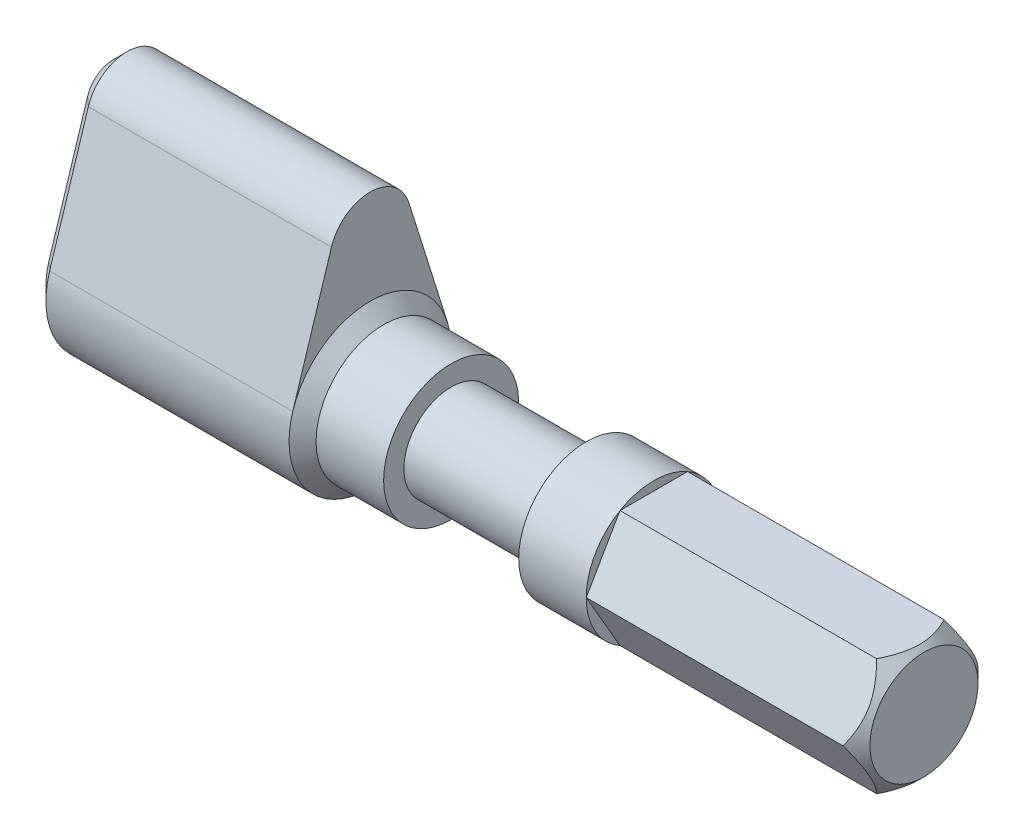
ISO-10303-21;
HEADER;
FILE_DESCRIPTION(('STEP AP214'),'2;1');
FILE_NAME('part.step','',(''),(''),'','','');
FILE_SCHEMA(('AUTOMOTIVE_DESIGN { 1 0 10303 214 1 1 1 1 }'));
ENDSEC;
DATA;
#1=APPLICATION_CONTEXT('core data for automotive mechanical design processes');
#2=APPLICATION_PROTOCOL_DEFINITION('international standard','automotive_design',2000,#1);
#3=PRODUCT_CONTEXT('',#1,'mechanical');
#4=PRODUCT('Part','Part','',(#3));
#5=PRODUCT_RELATED_PRODUCT_CATEGORY('part','',(#4));
#6=PRODUCT_DEFINITION_FORMATION('','',#4);
#7=PRODUCT_DEFINITION_CONTEXT('part definition',#1,'design');
#8=PRODUCT_DEFINITION('design','',#6,#7);
#9=PRODUCT_DEFINITION_SHAPE('','',#8);
#10=(LENGTH_UNIT() NAMED_UNIT(*) SI_UNIT(.MILLI.,.METRE.));
#11=(NAMED_UNIT(*) PLANE_ANGLE_UNIT() SI_UNIT($,.RADIAN.));
#12=(NAMED_UNIT(*) SI_UNIT($,.STERADIAN.) SOLID_ANGLE_UNIT());
#13=UNCERTAINTY_MEASURE_WITH_UNIT(LENGTH_MEASURE(1.E-05),#10,'distance_accuracy_value','');
#14=(GEOMETRIC_REPRESENTATION_CONTEXT(3) GLOBAL_UNCERTAINTY_ASSIGNED_CONTEXT((#13)) GLOBAL_UNIT_ASSIGNED_CONTEXT((#10,
#11,#12)) REPRESENTATION_CONTEXT('',''));
#15=CARTESIAN_POINT('',(0.,0.,0.));
#16=DIRECTION('',(0.,0.,1.));
#17=DIRECTION('',(1.,0.,0.));
#18=AXIS2_PLACEMENT_3D('',#15,#16,#17);
#19=CARTESIAN_POINT('',(0.,0.,0.));
#20=DIRECTION('',(-1.,0.,0.));
#21=DIRECTION('',(0.,0.,1.));
#22=AXIS2_PLACEMENT_3D('',#19,#20,#21);
#23=CYLINDRICAL_SURFACE('',#22,5.);
#24=CARTESIAN_POINT('',(25.,0.,0.));
#25=DIRECTION('',(-1.,0.,0.));
#26=DIRECTION('',(0.,-1.,0.));
#27=AXIS2_PLACEMENT_3D('',#24,#25,#26);
#28=CIRCLE('',#27,5.);
#29=CARTESIAN_POINT('',(25.,-5.,0.));
#30=VERTEX_POINT('',#29);
#31=EDGE_CURVE('E43',#30,#30,#28,.T.);
#32=ORIENTED_EDGE('',*,*,#31,.T.);
#33=EDGE_LOOP('',(#32));
#34=FACE_BOUND('',#33,.T.);
#35=CARTESIAN_POINT('',(20.,0.,0.));
#36=DIRECTION('',(-1.,0.,0.));
#37=DIRECTION('',(0.,0.,1.));
#38=AXIS2_PLACEMENT_3D('',#35,#36,#37);
#39=CIRCLE('',#38,5.);
#40=CARTESIAN_POINT('',(20.,0.,5.));
#41=VERTEX_POINT('',#40);
#42=EDGE_CURVE('E227',#41,#41,#39,.T.);
#43=ORIENTED_EDGE('',*,*,#42,.F.);
#44=EDGE_LOOP('',(#43));
#45=FACE_BOUND('',#44,.T.);
#46=ADVANCED_FACE('F38',(#34,#45),#23,.T.);
#47=CARTESIAN_POINT('',(0.,0.,0.));
#48=DIRECTION('',(1.,0.,0.));
#49=DIRECTION('',(0.,0.,-1.));
#50=AXIS2_PLACEMENT_3D('',#47,#48,#49);
#51=PLANE('',#50);
#52=DIRECTION('',(0.,0.953939201416946,-0.3));
#53=VECTOR('',#52,1.);
#54=CARTESIAN_POINT('',(0.,1.5,4.76969600708472));
#55=LINE('',#54,#53);
#56=CARTESIAN_POINT('',(0.,1.5,4.76969600708472));
#57=VERTEX_POINT('',#56);
#58=CARTESIAN_POINT('',(0.,10.6,1.90787840283388));
#59=VERTEX_POINT('',#58);
#60=EDGE_CURVE('E247',#57,#59,#55,.T.);
#61=ORIENTED_EDGE('',*,*,#60,.T.);
#62=CARTESIAN_POINT('',(0.,10.,0.));
#63=DIRECTION('',(1.,0.,0.));
#64=DIRECTION('',(0.,0.,-1.));
#65=AXIS2_PLACEMENT_3D('',#62,#63,#64);
#66=CIRCLE('',#65,1.99999999999999);
#67=CARTESIAN_POINT('',(0.,10.6,-1.90787840283388));
#68=VERTEX_POINT('',#67);
#69=EDGE_CURVE('E251',#59,#68,#66,.F.);
#70=ORIENTED_EDGE('',*,*,#69,.T.);
#71=DIRECTION('',(0.,-0.953939201416946,-0.3));
#72=VECTOR('',#71,1.);
#73=CARTESIAN_POINT('',(0.,1.5,-4.76969600708472));
#74=LINE('',#73,#72);
#75=CARTESIAN_POINT('',(0.,1.5,-4.76969600708472));
#76=VERTEX_POINT('',#75);
#77=EDGE_CURVE('E249',#68,#76,#74,.T.);
#78=ORIENTED_EDGE('',*,*,#77,.T.);
#79=CARTESIAN_POINT('',(0.,0.,0.));
#80=DIRECTION('',(1.,0.,0.));
#81=DIRECTION('',(0.,0.,-1.));
#82=AXIS2_PLACEMENT_3D('',#79,#80,#81);
#83=CIRCLE('',#82,4.99999999999999);
#84=EDGE_CURVE('E245',#76,#57,#83,.F.);
#85=ORIENTED_EDGE('',*,*,#84,.T.);
#86=EDGE_LOOP('',(#61,#70,#78,#85));
#87=FACE_BOUND('',#86,.T.);
#88=ADVANCED_FACE('F328',(#87),#51,.F.);
#89=CARTESIAN_POINT('',(0.,0.,0.));
#90=DIRECTION('',(-1.,0.,0.));
#91=DIRECTION('',(0.,0.,1.));
#92=AXIS2_PLACEMENT_3D('',#89,#90,#91);
#93=CYLINDRICAL_SURFACE('',#92,6.);
#94=DIRECTION('',(-1.,0.,0.));
#95=VECTOR('',#94,1.);
#96=CARTESIAN_POINT('',(19.,1.8,5.72363520850167));
#97=LINE('',#96,#95);
#98=CARTESIAN_POINT('',(19.,1.8,5.72363520850167));
#99=VERTEX_POINT('',#98);
#100=CARTESIAN_POINT('',(1.00000000000001,1.8,5.72363520850167));
#101=VERTEX_POINT('',#100);
#102=EDGE_CURVE('E224',#99,#101,#97,.T.);
#103=ORIENTED_EDGE('',*,*,#102,.T.);
#104=CARTESIAN_POINT('',(1.00000000000001,0.,0.));
#105=DIRECTION('',(1.,0.,0.));
#106=DIRECTION('',(0.,0.,-1.));
#107=AXIS2_PLACEMENT_3D('',#104,#105,#106);
#108=CIRCLE('',#107,6.);
#109=CARTESIAN_POINT('',(1.00000000000001,1.8,-5.72363520850168));
#110=VERTEX_POINT('',#109);
#111=EDGE_CURVE('E261',#101,#110,#108,.T.);
#112=ORIENTED_EDGE('',*,*,#111,.T.);
#113=DIRECTION('',(-1.,0.,0.));
#114=VECTOR('',#113,1.);
#115=CARTESIAN_POINT('',(19.,1.8,-5.72363520850168));
#116=LINE('',#115,#114);
#117=CARTESIAN_POINT('',(19.,1.8,-5.72363520850168));
#118=VERTEX_POINT('',#117);
#119=EDGE_CURVE('E228',#118,#110,#116,.T.);
#120=ORIENTED_EDGE('',*,*,#119,.F.);
#121=CARTESIAN_POINT('',(19.,0.,0.));
#122=DIRECTION('',(-1.,0.,0.));
#123=DIRECTION('',(0.,0.,1.));
#124=AXIS2_PLACEMENT_3D('',#121,#122,#123);
#125=CIRCLE('',#124,6.);
#126=EDGE_CURVE('E238',#118,#99,#125,.T.);
#127=ORIENTED_EDGE('',*,*,#126,.T.);
#128=EDGE_LOOP('',(#103,#112,#120,#127));
#129=FACE_BOUND('',#128,.T.);
#130=ADVANCED_FACE('F325',(#129),#93,.T.);
#131=CARTESIAN_POINT('',(19.,0.,0.));
#132=DIRECTION('',(-1.,0.,0.));
#133=DIRECTION('',(0.,0.,1.));
#134=AXIS2_PLACEMENT_3D('',#131,#132,#133);
#135=CONICAL_SURFACE('',#134,6.,0.785398163397451);
#136=ORIENTED_EDGE('',*,*,#42,.T.);
#137=EDGE_LOOP('',(#136));
#138=FACE_BOUND('',#137,.T.);
#139=EDGE_CURVE('E239',#99,#118,#125,.T.);
#140=ORIENTED_EDGE('',*,*,#139,.F.);
#141=ORIENTED_EDGE('',*,*,#126,.F.);
#142=EDGE_LOOP('',(#140,#141));
#143=FACE_BOUND('',#142,.T.);
#144=ADVANCED_FACE('F316',(#138,#143),#135,.T.);
#145=CARTESIAN_POINT('',(19.,1.8,5.72363520850167));
#146=DIRECTION('',(0.,-0.3,-0.953939201416946));
#147=DIRECTION('',(0.,0.953939201416946,-0.3));
#148=AXIS2_PLACEMENT_3D('',#145,#146,#147);
#149=PLANE('',#148);
#150=DIRECTION('',(-1.,0.,0.));
#151=VECTOR('',#150,1.);
#152=CARTESIAN_POINT('',(19.,10.9,2.86181760425084));
#153=LINE('',#152,#151);
#154=CARTESIAN_POINT('',(19.,10.9,2.86181760425084));
#155=VERTEX_POINT('',#154);
#156=CARTESIAN_POINT('',(1.00000000000001,10.9,2.86181760425084));
#157=VERTEX_POINT('',#156);
#158=EDGE_CURVE('E223',#155,#157,#153,.T.);
#159=ORIENTED_EDGE('',*,*,#158,.T.);
#160=DIRECTION('',(0.,-0.953939201416946,0.3));
#161=VECTOR('',#160,1.);
#162=CARTESIAN_POINT('',(1.00000000000001,1.8,5.72363520850167));
#163=LINE('',#162,#161);
#164=EDGE_CURVE('E259',#157,#101,#163,.T.);
#165=ORIENTED_EDGE('',*,*,#164,.T.);
#166=ORIENTED_EDGE('',*,*,#102,.F.);
#167=DIRECTION('',(0.,-0.953939201416946,0.3));
#168=VECTOR('',#167,1.);
#169=CARTESIAN_POINT('',(19.,1.8,5.72363520850167));
#170=LINE('',#169,#168);
#171=EDGE_CURVE('E213',#155,#99,#170,.T.);
#172=ORIENTED_EDGE('',*,*,#171,.F.);
#173=EDGE_LOOP('',(#159,#165,#166,#172));
#174=FACE_BOUND('',#173,.T.);
#175=ADVANCED_FACE('F309',(#174),#149,.F.);
#176=CARTESIAN_POINT('',(19.,1.8,-5.72363520850168));
#177=DIRECTION('',(0.,0.3,-0.953939201416946));
#178=DIRECTION('',(0.,0.953939201416946,0.3));
#179=AXIS2_PLACEMENT_3D('',#176,#177,#178);
#180=PLANE('',#179);
#181=ORIENTED_EDGE('',*,*,#119,.T.);
#182=DIRECTION('',(0.,0.953939201416946,0.3));
#183=VECTOR('',#182,1.);
#184=CARTESIAN_POINT('',(1.00000000000001,10.9,-2.86181760425084));
#185=LINE('',#184,#183);
#186=CARTESIAN_POINT('',(1.00000000000001,10.9,-2.86181760425084));
#187=VERTEX_POINT('',#186);
#188=EDGE_CURVE('E257',#110,#187,#185,.T.);
#189=ORIENTED_EDGE('',*,*,#188,.T.);
#190=DIRECTION('',(-1.,0.,0.));
#191=VECTOR('',#190,1.);
#192=CARTESIAN_POINT('',(19.,10.9,-2.86181760425084));
#193=LINE('',#192,#191);
#194=CARTESIAN_POINT('',(19.,10.9,-2.86181760425084));
#195=VERTEX_POINT('',#194);
#196=EDGE_CURVE('E231',#195,#187,#193,.T.);
#197=ORIENTED_EDGE('',*,*,#196,.F.);
#198=DIRECTION('',(0.,-0.953939201416946,-0.3));
#199=VECTOR('',#198,1.);
#200=CARTESIAN_POINT('',(19.,1.8,-5.72363520850168));
#201=LINE('',#200,#199);
#202=EDGE_CURVE('E220',#195,#118,#201,.T.);
#203=ORIENTED_EDGE('',*,*,#202,.T.);
#204=EDGE_LOOP('',(#181,#189,#197,#203));
#205=FACE_BOUND('',#204,.T.);
#206=ADVANCED_FACE('F306',(#205),#180,.T.);
#207=CARTESIAN_POINT('',(19.,10.,0.));
#208=DIRECTION('',(-1.,0.,0.));
#209=DIRECTION('',(0.,0.,1.));
#210=AXIS2_PLACEMENT_3D('',#207,#208,#209);
#211=CYLINDRICAL_SURFACE('',#210,3.);
#212=ORIENTED_EDGE('',*,*,#196,.T.);
#213=CARTESIAN_POINT('',(1.00000000000001,10.,0.));
#214=DIRECTION('',(1.,0.,0.));
#215=DIRECTION('',(0.,0.,-1.));
#216=AXIS2_PLACEMENT_3D('',#213,#214,#215);
#217=CIRCLE('',#216,3.);
#218=EDGE_CURVE('E254',#187,#157,#217,.T.);
#219=ORIENTED_EDGE('',*,*,#218,.T.);
#220=ORIENTED_EDGE('',*,*,#158,.F.);
#221=CARTESIAN_POINT('',(19.,10.,0.));
#222=DIRECTION('',(-1.,0.,0.));
#223=DIRECTION('',(0.,0.,1.));
#224=AXIS2_PLACEMENT_3D('',#221,#222,#223);
#225=CIRCLE('',#224,3.);
#226=EDGE_CURVE('E216',#155,#195,#225,.T.);
#227=ORIENTED_EDGE('',*,*,#226,.T.);
#228=EDGE_LOOP('',(#212,#219,#220,#227));
#229=FACE_BOUND('',#228,.T.);
#230=ADVANCED_FACE('F304',(#229),#211,.T.);
#231=CARTESIAN_POINT('',(19.,0.,0.));
#232=DIRECTION('',(-1.,0.,0.));
#233=DIRECTION('',(0.,0.,1.));
#234=AXIS2_PLACEMENT_3D('',#231,#232,#233);
#235=PLANE('',#234);
#236=ORIENTED_EDGE('',*,*,#171,.T.);
#237=ORIENTED_EDGE('',*,*,#139,.T.);
#238=ORIENTED_EDGE('',*,*,#202,.F.);
#239=ORIENTED_EDGE('',*,*,#226,.F.);
#240=EDGE_LOOP('',(#236,#237,#238,#239));
#241=FACE_BOUND('',#240,.T.);
#242=ADVANCED_FACE('F301',(#241),#235,.F.);
#243=CARTESIAN_POINT('',(0.,0.,0.));
#244=DIRECTION('',(1.,0.,0.));
#245=DIRECTION('',(0.,0.,-1.));
#246=AXIS2_PLACEMENT_3D('',#243,#244,#245);
#247=CONICAL_SURFACE('',#246,4.99999999999999,0.785398163397449);
#248=DIRECTION('',(-0.707106781186547,-0.212132034355965,0.674536878161602));
#249=VECTOR('',#248,1.);
#250=CARTESIAN_POINT('',(1.00000000000001,1.8,-5.72363520850167));
#251=LINE('',#250,#249);
#252=EDGE_CURVE('E266',#110,#76,#251,.T.);
#253=ORIENTED_EDGE('',*,*,#252,.F.);
#254=ORIENTED_EDGE('',*,*,#111,.F.);
#255=DIRECTION('',(0.707106781186547,0.212132034355964,0.674536878161602));
#256=VECTOR('',#255,1.);
#257=CARTESIAN_POINT('',(0.,1.5,4.76969600708472));
#258=LINE('',#257,#256);
#259=EDGE_CURVE('E217',#57,#101,#258,.T.);
#260=ORIENTED_EDGE('',*,*,#259,.F.);
#261=ORIENTED_EDGE('',*,*,#84,.F.);
#262=EDGE_LOOP('',(#253,#254,#260,#261));
#263=FACE_BOUND('',#262,.T.);
#264=ADVANCED_FACE('F41',(#263),#247,.T.);
#265=CARTESIAN_POINT('',(1.00000000000001,1.8,5.72363520850167));
#266=DIRECTION('',(0.707106781186547,-0.212132034355964,-0.674536878161602));
#267=DIRECTION('',(0.,-0.953939201416946,0.3));
#268=AXIS2_PLACEMENT_3D('',#265,#266,#267);
#269=PLANE('',#268);
#270=ORIENTED_EDGE('',*,*,#259,.T.);
#271=ORIENTED_EDGE('',*,*,#164,.F.);
#272=DIRECTION('',(0.707106781186548,0.212132034355964,0.674536878161602));
#273=VECTOR('',#272,1.);
#274=CARTESIAN_POINT('',(0.,10.6,1.90787840283388));
#275=LINE('',#274,#273);
#276=EDGE_CURVE('E264',#59,#157,#275,.T.);
#277=ORIENTED_EDGE('',*,*,#276,.F.);
#278=ORIENTED_EDGE('',*,*,#60,.F.);
#279=EDGE_LOOP('',(#270,#271,#277,#278));
#280=FACE_BOUND('',#279,.T.);
#281=ADVANCED_FACE('F510',(#280),#269,.F.);
#282=CARTESIAN_POINT('',(0.,1.5,-4.76969600708472));
#283=DIRECTION('',(-0.707106781186547,0.212132034355964,-0.674536878161602));
#284=DIRECTION('',(0.,0.953939201416946,0.3));
#285=AXIS2_PLACEMENT_3D('',#282,#283,#284);
#286=PLANE('',#285);
#287=ORIENTED_EDGE('',*,*,#252,.T.);
#288=ORIENTED_EDGE('',*,*,#77,.F.);
#289=DIRECTION('',(-0.707106781186548,-0.212132034355964,0.674536878161602));
#290=VECTOR('',#289,1.);
#291=CARTESIAN_POINT('',(1.00000000000001,10.9,-2.86181760425084));
#292=LINE('',#291,#290);
#293=EDGE_CURVE('E202',#187,#68,#292,.T.);
#294=ORIENTED_EDGE('',*,*,#293,.F.);
#295=ORIENTED_EDGE('',*,*,#188,.F.);
#296=EDGE_LOOP('',(#287,#288,#294,#295));
#297=FACE_BOUND('',#296,.T.);
#298=ADVANCED_FACE('F359',(#297),#286,.T.);
#299=CARTESIAN_POINT('',(0.,10.,0.));
#300=DIRECTION('',(1.,0.,0.));
#301=DIRECTION('',(0.,0.,-1.));
#302=AXIS2_PLACEMENT_3D('',#299,#300,#301);
#303=CONICAL_SURFACE('',#302,1.99999999999999,0.785398163397448);
#304=ORIENTED_EDGE('',*,*,#276,.T.);
#305=ORIENTED_EDGE('',*,*,#218,.F.);
#306=ORIENTED_EDGE('',*,*,#293,.T.);
#307=ORIENTED_EDGE('',*,*,#69,.F.);
#308=EDGE_LOOP('',(#304,#305,#306,#307));
#309=FACE_BOUND('',#308,.T.);
#310=ADVANCED_FACE('F351',(#309),#303,.T.);
#311=CARTESIAN_POINT('',(25.,3.5,0.));
#312=DIRECTION('',(-1.,0.,0.));
#313=DIRECTION('',(0.,-1.,0.));
#314=AXIS2_PLACEMENT_3D('',#311,#312,#313);
#315=PLANE('',#314);
#316=CARTESIAN_POINT('',(25.,0.,0.));
#317=DIRECTION('',(1.,0.,0.));
#318=DIRECTION('',(0.,1.,0.));
#319=AXIS2_PLACEMENT_3D('',#316,#317,#318);
#320=CIRCLE('',#319,3.50000000000001);
#321=CARTESIAN_POINT('',(25.,3.5,0.));
#322=VERTEX_POINT('',#321);
#323=EDGE_CURVE('E185',#322,#322,#320,.T.);
#324=ORIENTED_EDGE('',*,*,#323,.F.);
#325=EDGE_LOOP('',(#324));
#326=FACE_BOUND('',#325,.T.);
#327=ORIENTED_EDGE('',*,*,#31,.F.);
#328=EDGE_LOOP('',(#327));
#329=FACE_BOUND('',#328,.T.);
#330=ADVANCED_FACE('F348',(#326,#329),#315,.F.);
#331=CARTESIAN_POINT('',(35.,3.5,0.));
#332=DIRECTION('',(1.,0.,0.));
#333=DIRECTION('',(0.,1.,0.));
#334=AXIS2_PLACEMENT_3D('',#331,#332,#333);
#335=PLANE('',#334);
#336=CARTESIAN_POINT('',(35.,0.,0.));
#337=DIRECTION('',(1.,0.,0.));
#338=DIRECTION('',(0.,1.,0.));
#339=AXIS2_PLACEMENT_3D('',#336,#337,#338);
#340=CIRCLE('',#339,3.50000000000003);
#341=CARTESIAN_POINT('',(35.,3.5,0.));
#342=VERTEX_POINT('',#341);
#343=EDGE_CURVE('E180',#342,#342,#340,.T.);
#344=ORIENTED_EDGE('',*,*,#343,.T.);
#345=EDGE_LOOP('',(#344));
#346=FACE_BOUND('',#345,.T.);
#347=CARTESIAN_POINT('',(35.,0.,0.));
#348=DIRECTION('',(1.,0.,0.));
#349=DIRECTION('',(0.,1.,0.));
#350=AXIS2_PLACEMENT_3D('',#347,#348,#349);
#351=CIRCLE('',#350,5.);
#352=CARTESIAN_POINT('',(35.,5.,0.));
#353=VERTEX_POINT('',#352);
#354=EDGE_CURVE('E178',#353,#353,#351,.T.);
#355=ORIENTED_EDGE('',*,*,#354,.F.);
#356=EDGE_LOOP('',(#355));
#357=FACE_BOUND('',#356,.T.);
#358=ADVANCED_FACE('F350',(#346,#357),#335,.F.);
#359=CARTESIAN_POINT('',(40.,0.,0.));
#360=DIRECTION('',(1.,0.,0.));
#361=DIRECTION('',(0.,1.,0.));
#362=AXIS2_PLACEMENT_3D('',#359,#360,#361);
#363=CYLINDRICAL_SURFACE('',#362,3.50000000000002);
#364=ORIENTED_EDGE('',*,*,#343,.F.);
#365=EDGE_LOOP('',(#364));
#366=FACE_BOUND('',#365,.T.);
#367=ORIENTED_EDGE('',*,*,#323,.T.);
#368=EDGE_LOOP('',(#367));
#369=FACE_BOUND('',#368,.T.);
#370=ADVANCED_FACE('F321',(#366,#369),#363,.T.);
#371=CARTESIAN_POINT('',(60.,5.,0.));
#372=DIRECTION('',(-1.,0.,0.));
#373=DIRECTION('',(0.,0.,1.));
#374=AXIS2_PLACEMENT_3D('',#371,#372,#373);
#375=PLANE('',#374);
#376=CARTESIAN_POINT('',(60.,0.,0.));
#377=DIRECTION('',(-1.,0.,0.));
#378=DIRECTION('',(0.,0.,1.));
#379=AXIS2_PLACEMENT_3D('',#376,#377,#378);
#380=CIRCLE('',#379,3.99999999999999);
#381=CARTESIAN_POINT('',(60.,0.,3.99999999999999));
#382=VERTEX_POINT('',#381);
#383=EDGE_CURVE('E242',#382,#382,#380,.F.);
#384=ORIENTED_EDGE('',*,*,#383,.T.);
#385=EDGE_LOOP('',(#384));
#386=FACE_BOUND('',#385,.T.);
#387=ADVANCED_FACE('F318',(#386),#375,.F.);
#388=CARTESIAN_POINT('',(59.,0.,0.));
#389=DIRECTION('',(-1.,0.,0.));
#390=DIRECTION('',(0.,0.,1.));
#391=AXIS2_PLACEMENT_3D('',#388,#389,#390);
#392=CONICAL_SURFACE('',#391,5.,0.785398163397454);
#393=ORIENTED_EDGE('',*,*,#383,.F.);
#394=EDGE_LOOP('',(#393));
#395=FACE_BOUND('',#394,.T.);
#396=CARTESIAN_POINT('',(55.253678646667,-4.33012701892227,7.59921951359276));
#397=CARTESIAN_POINT('',(55.351184265633,-4.33012701892227,7.48699247756579));
#398=CARTESIAN_POINT('',(55.4483913750578,-4.33012701892227,7.37450605913894));
#399=CARTESIAN_POINT('',(55.6421247861555,-4.33012701892227,7.14894544849829));
#400=CARTESIAN_POINT('',(55.7386510767765,-4.33012701892227,7.03587124679438));
#401=CARTESIAN_POINT('',(56.0271662461691,-4.33012701892226,6.6955651902009));
#402=CARTESIAN_POINT('',(56.218002079582,-4.33012701892226,6.46735241242819));
#403=CARTESIAN_POINT('',(56.5999051779751,-4.33012701892226,6.002449107588));
#404=CARTESIAN_POINT('',(56.7908811722092,-4.33012701892225,5.76568333547577));
#405=CARTESIAN_POINT('',(57.1671121203224,-4.33012701892225,5.2877302731454));
#406=CARTESIAN_POINT('',(57.3523684910034,-4.33012701892225,5.04654410187618));
#407=CARTESIAN_POINT('',(57.7152539731287,-4.33012701892224,4.55795427576481));
#408=CARTESIAN_POINT('',(57.8928729934364,-4.33012701892224,4.31054304061876));
#409=CARTESIAN_POINT('',(58.1507750381669,-4.33012701892223,3.93341818828443));
#410=CARTESIAN_POINT('',(58.2353592003148,-4.33012701892223,3.80664733518679));
#411=CARTESIAN_POINT('',(58.4009968353064,-4.33012701892223,3.55082533863251));
#412=CARTESIAN_POINT('',(58.4820506125323,-4.33012701892223,3.42177439311452));
#413=CARTESIAN_POINT('',(58.639251894182,-4.33012701892223,3.16199806432151));
#414=CARTESIAN_POINT('',(58.7154310235148,-4.33012701892222,3.03129190461657));
#415=CARTESIAN_POINT('',(58.8625188449221,-4.33012701892222,2.76690858749133));
#416=CARTESIAN_POINT('',(58.9334269012938,-4.33012701892222,2.63323107423648));
#417=CARTESIAN_POINT('',(59.0685737969327,-4.33012701892222,2.36276633080908));
#418=CARTESIAN_POINT('',(59.1328222970525,-4.33012701892222,2.22598396638425));
#419=CARTESIAN_POINT('',(59.2531442688084,-4.33012701892221,1.94889793365945));
#420=CARTESIAN_POINT('',(59.3092209000482,-4.33012701892221,1.80859565104077));
#421=CARTESIAN_POINT('',(59.4124815838396,-4.33012701892221,1.52109101625562));
#422=CARTESIAN_POINT('',(59.4594340085931,-4.33012701892221,1.37380428933824));
#423=CARTESIAN_POINT('',(59.5405572677146,-4.3301270189222,1.07571750853234));
#424=CARTESIAN_POINT('',(59.5747301384307,-4.3301270189222,0.924918018453817));
#425=CARTESIAN_POINT('',(59.6280097359017,-4.3301270189222,0.621622317866048));
#426=CARTESIAN_POINT('',(59.6472114182584,-4.3301270189222,0.469143126258926));
#427=CARTESIAN_POINT('',(59.6694938314688,-4.3301270189222,0.163002209399381));
#428=CARTESIAN_POINT('',(59.6725764251674,-4.33012701892219,0.00934062284916741));
#429=CARTESIAN_POINT('',(59.6623702719492,-4.33012701892219,-0.297696033322854));
#430=CARTESIAN_POINT('',(59.6490527373931,-4.33012701892219,-0.451070124483411));
#431=CARTESIAN_POINT('',(59.6070212422452,-4.33012701892219,-0.755678508307949));
#432=CARTESIAN_POINT('',(59.5783041758868,-4.33012701892218,-0.906912363013369));
#433=CARTESIAN_POINT('',(59.5071281237141,-4.33012701892218,-1.2072112884747));
#434=CARTESIAN_POINT('',(59.4645709903875,-4.33012701892218,-1.35625267713981));
#435=CARTESIAN_POINT('',(59.3680526231404,-4.33012701892218,-1.65053794073633));
#436=CARTESIAN_POINT('',(59.314091177979,-4.33012701892217,-1.79578174526951));
#437=CARTESIAN_POINT('',(59.1844175150299,-4.33012701892217,-2.11307073215622));
#438=CARTESIAN_POINT('',(59.1065212639994,-4.33012701892217,-2.28421549179882));
#439=CARTESIAN_POINT('',(58.9403251951652,-4.33012701892217,-2.62142059572496));
#440=CARTESIAN_POINT('',(58.8520194140098,-4.33012701892216,-2.78747795627226));
#441=CARTESIAN_POINT('',(58.6673110360987,-4.33012701892216,-3.11543948043567));
#442=CARTESIAN_POINT('',(58.5708921686729,-4.33012701892216,-3.27733440507174));
#443=CARTESIAN_POINT('',(58.3719729247574,-4.33012701892216,-3.59727339089193));
#444=CARTESIAN_POINT('',(58.2694737465553,-4.33012701892215,-3.75531820224002));
#445=CARTESIAN_POINT('',(58.0591610978368,-4.33012701892215,-4.06905173475937));
#446=CARTESIAN_POINT('',(57.9513219741766,-4.33012701892215,-4.22472317767943));
#447=CARTESIAN_POINT('',(57.7318530724425,-4.33012701892215,-4.53336890520702));
#448=CARTESIAN_POINT('',(57.6202231588762,-4.33012701892214,-4.68634309311037));
#449=CARTESIAN_POINT('',(57.3940651748503,-4.33012701892214,-4.98984972858055));
#450=CARTESIAN_POINT('',(57.2795406432407,-4.33012701892214,-5.14038482040835));
#451=CARTESIAN_POINT('',(57.0480350376163,-4.33012701892214,-5.4395578430845));
#452=CARTESIAN_POINT('',(56.9310538824902,-4.33012701892214,-5.58819571103004));
#453=CARTESIAN_POINT('',(56.6860390059487,-4.33012701892213,-5.89518635745039));
#454=CARTESIAN_POINT('',(56.557845087557,-4.33012701892213,-6.05341108869306));
#455=CARTESIAN_POINT('',(56.2995432142047,-4.33012701892213,-6.3682912521164));
#456=CARTESIAN_POINT('',(56.1694352351716,-4.33012701892213,-6.52494666451858));
#457=CARTESIAN_POINT('',(55.9091007740072,-4.33012701892212,-6.83518118684633));
#458=CARTESIAN_POINT('',(55.778891912024,-4.33012701892212,-6.98877510446444));
#459=CARTESIAN_POINT('',(55.5171933628356,-4.33012701892212,-7.29480873067978));
#460=CARTESIAN_POINT('',(55.3857039698277,-4.33012701892212,-7.44724869072828));
#461=CARTESIAN_POINT('',(55.253678646667,-4.33012701892211,-7.59921951359285));
#462=B_SPLINE_CURVE_WITH_KNOTS('',3,(#396,#397,#398,#399,#400,#401,#402,#403,#404,#405,#406,
#407,#408,#409,#410,#411,#412,#413,#414,#415,#416,#417,#418,#419,#420,#421,#422,#423,#424,#425,
#426,#427,#428,#429,#430,#431,#432,#433,#434,#435,#436,#437,#438,#439,#440,#441,#442,#443,#444,
#445,#446,#447,#448,#449,#450,#451,#452,#453,#454,#455,#456,#457,#458,#459,#460,#461),
.UNSPECIFIED.,.F.,.F.,(4,2,2,2,2,2,2,2,2,2,2,2,2,2,2,2,2,2,2,2,2,2,2,2,2,2,2,2,2,2,2,2,4),(0.,
0.446003957696261,0.892015138902988,1.7844454520532,2.69694127159321,3.60920921409761,
4.52264764303548,4.97979846611421,5.43690979628032,5.89066842739227,6.34448169430949,
6.79762713021698,7.25059689265081,7.71388352952142,8.17709631285969,8.63734668751583,
9.0975438709533,9.5585500050736,10.0196491495725,10.4840922330261,10.9485439200596,
11.5121821150825,12.0761447876207,12.6412667411847,13.2062776900009,13.7743322928724,
14.3424072208555,14.9098183649614,15.4772482730704,16.0881462572518,16.6990519310607,
17.303121069493,17.9070545540327),.UNSPECIFIED.);
#463=CARTESIAN_POINT('',(59.,-4.33012701892222,2.49999999999996));
#464=VERTEX_POINT('',#463);
#465=CARTESIAN_POINT('',(59.,-4.33012701892217,-2.50000000000005));
#466=VERTEX_POINT('',#465);
#467=EDGE_CURVE('E169',#464,#466,#462,.T.);
#468=ORIENTED_EDGE('',*,*,#467,.T.);
#469=CARTESIAN_POINT('',(58.9998845259462,-4.33032701892217,-2.49988452994621));
#470=CARTESIAN_POINT('',(59.0428679014172,-4.25587160985146,-2.54287138041581));
#471=CARTESIAN_POINT('',(59.0845322160249,-4.18084389235357,-2.5861886533099));
#472=CARTESIAN_POINT('',(59.1648214570814,-4.02953155373266,-2.67354887274439));
#473=CARTESIAN_POINT('',(59.2034447234691,-3.95324627322793,-2.717592199979));
#474=CARTESIAN_POINT('',(59.3144804420678,-3.72162689198001,-2.85131771209203));
#475=CARTESIAN_POINT('',(59.3815850955109,-3.56433197010419,-2.94213197757919));
#476=CARTESIAN_POINT('',(59.4964973477853,-3.2471341417625,-3.12526622915862));
#477=CARTESIAN_POINT('',(59.5445944631137,-3.08731231644054,-3.21753940303064));
#478=CARTESIAN_POINT('',(59.6002311247179,-2.84495193082737,-3.3574662369053));
#479=CARTESIAN_POINT('',(59.616017735568,-2.76380830262029,-3.40431453249368));
#480=CARTESIAN_POINT('',(59.6417307019677,-2.60083395885696,-3.49840781373644));
#481=CARTESIAN_POINT('',(59.6516579334098,-2.51900334785051,-3.54565273902896));
#482=CARTESIAN_POINT('',(59.6683021731439,-2.31959642528904,-3.6607803794481));
#483=CARTESIAN_POINT('',(59.6717946588034,-2.20180526649963,-3.72878713668333));
#484=CARTESIAN_POINT('',(59.6659341038671,-1.96643521729809,-3.864678097949));
#485=CARTESIAN_POINT('',(59.6565765602643,-1.84885641576179,-3.93256225066698));
#486=CARTESIAN_POINT('',(59.6255675384182,-1.6148072909115,-4.06769057590289));
#487=CARTESIAN_POINT('',(59.6039023105296,-1.49833835570953,-4.13493394699398));
#488=CARTESIAN_POINT('',(59.5494557859257,-1.26740228961784,-4.2682649469176));
#489=CARTESIAN_POINT('',(59.516675341522,-1.15293500594955,-4.3343526639569));
#490=CARTESIAN_POINT('',(59.4492338613142,-0.949729264101391,-4.45167355371381));
#491=CARTESIAN_POINT('',(59.416346093771,-0.860540959929992,-4.50316644513573));
#492=CARTESIAN_POINT('',(59.3452704801555,-0.683765489448393,-4.6052278106044));
#493=CARTESIAN_POINT('',(59.3070824729594,-0.596178371904851,-4.65579625649571));
#494=CARTESIAN_POINT('',(59.2262624986279,-0.422881133456804,-4.75584946376351));
#495=CARTESIAN_POINT('',(59.1836445061233,-0.337166083761056,-4.80533707077895));
#496=CARTESIAN_POINT('',(59.0945241637333,-0.1673232967384,-4.90339584958639));
#497=CARTESIAN_POINT('',(59.0480241967749,-0.0831946239455046,-4.95196756146994));
#498=CARTESIAN_POINT('',(58.9998845259462,0.000200000000000178,-5.00011547005384));
#499=B_SPLINE_CURVE_WITH_KNOTS('',3,(#469,#470,#471,#472,#473,#474,#475,#476,#477,#478,#479,
#480,#481,#482,#483,#484,#485,#486,#487,#488,#489,#490,#491,#492,#493,#494,#495,#496,#497,#498),
.UNSPECIFIED.,.F.,.F.,(4,2,2,2,2,2,2,2,2,2,2,2,2,2,4),(0.,0.288343025050058,0.576842376266665,
1.15695604992331,1.72785747296511,2.01274823950902,2.29759640821262,2.70513724110403,
3.11282092407139,3.52096095288678,3.92906969271705,4.25324617843569,4.5774325210652,
4.90062556888117,5.22362166510132),.UNSPECIFIED.);
#500=CARTESIAN_POINT('',(59.,0.,-5.));
#501=VERTEX_POINT('',#500);
#502=EDGE_CURVE('E167',#466,#501,#499,.T.);
#503=ORIENTED_EDGE('',*,*,#502,.T.);
#504=CARTESIAN_POINT('',(58.9998845259462,-0.0002,-5.00011547005384));
#505=CARTESIAN_POINT('',(59.0428679014172,0.0742554090707036,-4.95712861958425));
#506=CARTESIAN_POINT('',(59.0845322160249,0.149283126568601,-4.91381134669015));
#507=CARTESIAN_POINT('',(59.1648214570814,0.300595465189512,-4.82645112725566));
#508=CARTESIAN_POINT('',(59.2034447234691,0.376880745694241,-4.78240780002105));
#509=CARTESIAN_POINT('',(59.3144804420678,0.608500126942169,-4.64868228790802));
#510=CARTESIAN_POINT('',(59.3815850955109,0.76579504881798,-4.55786802242086));
#511=CARTESIAN_POINT('',(59.4964973477853,1.08299287715967,-4.37473377084142));
#512=CARTESIAN_POINT('',(59.5445944631137,1.24281470248164,-4.2824605969694));
#513=CARTESIAN_POINT('',(59.6002311247179,1.48517508809481,-4.14253376309474));
#514=CARTESIAN_POINT('',(59.616017735568,1.56631871630189,-4.09568546750636));
#515=CARTESIAN_POINT('',(59.6417307019677,1.72929306006522,-4.0015921862636));
#516=CARTESIAN_POINT('',(59.6516579334098,1.81112367107167,-3.95434726097107));
#517=CARTESIAN_POINT('',(59.6683021731439,2.01053059363314,-3.83921962055193));
#518=CARTESIAN_POINT('',(59.6717946588034,2.12832175242255,-3.7712128633167));
#519=CARTESIAN_POINT('',(59.6659341038672,2.36369180162409,-3.63532190205102));
#520=CARTESIAN_POINT('',(59.6565765602643,2.48127060316039,-3.56743774933304));
#521=CARTESIAN_POINT('',(59.6255675384182,2.71531972801068,-3.43230942409713));
#522=CARTESIAN_POINT('',(59.6039023105296,2.83178866321264,-3.36506605300605));
#523=CARTESIAN_POINT('',(59.5494557859257,3.06272472930433,-3.23173505308242));
#524=CARTESIAN_POINT('',(59.516675341522,3.17719201297262,-3.16564733604312));
#525=CARTESIAN_POINT('',(59.4492338613143,3.38039775482078,-3.04832644628621));
#526=CARTESIAN_POINT('',(59.4163460937711,3.46958605899218,-2.99683355486429));
#527=CARTESIAN_POINT('',(59.3452704801555,3.64636152947379,-2.89477218939561));
#528=CARTESIAN_POINT('',(59.3070824729594,3.73394864701733,-2.8442037435043));
#529=CARTESIAN_POINT('',(59.2262624986279,3.90724588546538,-2.7441505362365));
#530=CARTESIAN_POINT('',(59.1836445061233,3.99296093516113,-2.69466292922106));
#531=CARTESIAN_POINT('',(59.0945241637333,4.16280372218379,-2.59660415041361));
#532=CARTESIAN_POINT('',(59.0480241967749,4.24693239497669,-2.54803243853006));
#533=CARTESIAN_POINT('',(58.9998845259462,4.3303270189222,-2.49988452994615));
#534=B_SPLINE_CURVE_WITH_KNOTS('',3,(#504,#505,#506,#507,#508,#509,#510,#511,#512,#513,#514,
#515,#516,#517,#518,#519,#520,#521,#522,#523,#524,#525,#526,#527,#528,#529,#530,#531,#532,#533),
.UNSPECIFIED.,.F.,.F.,(4,2,2,2,2,2,2,2,2,2,2,2,2,2,4),(0.,0.288343025050063,0.576842376266671,
1.15695604992333,1.72785747296513,2.01274823950905,2.29759640821265,2.70513724110406,
3.11282092407142,3.52096095288681,3.92906969271708,4.25324617843572,4.57743252106525,
4.90062556888123,5.22362166510139),.UNSPECIFIED.);
#535=CARTESIAN_POINT('',(59.,4.3301270189222,-2.5));
#536=VERTEX_POINT('',#535);
#537=EDGE_CURVE('E148',#501,#536,#534,.T.);
#538=ORIENTED_EDGE('',*,*,#537,.T.);
#539=CARTESIAN_POINT('',(55.253678646667,4.33012701892222,-7.59921951359279));
#540=CARTESIAN_POINT('',(55.351184265633,4.33012701892222,-7.48699247756582));
#541=CARTESIAN_POINT('',(55.4483913750578,4.33012701892222,-7.37450605913897));
#542=CARTESIAN_POINT('',(55.6421247861555,4.33012701892222,-7.14894544849832));
#543=CARTESIAN_POINT('',(55.7386510767765,4.33012701892222,-7.03587124679441));
#544=CARTESIAN_POINT('',(56.0271662461691,4.33012701892222,-6.69556519020093));
#545=CARTESIAN_POINT('',(56.218002079582,4.33012701892222,-6.46735241242822));
#546=CARTESIAN_POINT('',(56.5999051779751,4.33012701892221,-6.00244910758803));
#547=CARTESIAN_POINT('',(56.7908811722092,4.33012701892221,-5.7656833354758));
#548=CARTESIAN_POINT('',(57.1671121203224,4.33012701892221,-5.28773027314543));
#549=CARTESIAN_POINT('',(57.3523684910034,4.33012701892221,-5.04654410187621));
#550=CARTESIAN_POINT('',(57.7152539731287,4.33012701892221,-4.55795427576484));
#551=CARTESIAN_POINT('',(57.8928729934364,4.33012701892221,-4.31054304061879));
#552=CARTESIAN_POINT('',(58.1507750381669,4.33012701892221,-3.93341818828446));
#553=CARTESIAN_POINT('',(58.2353592003148,4.33012701892221,-3.80664733518683));
#554=CARTESIAN_POINT('',(58.4009968353064,4.33012701892221,-3.55082533863254));
#555=CARTESIAN_POINT('',(58.4820506125323,4.33012701892221,-3.42177439311455));
#556=CARTESIAN_POINT('',(58.639251894182,4.3301270189222,-3.16199806432155));
#557=CARTESIAN_POINT('',(58.7154310235148,4.3301270189222,-3.0312919046166));
#558=CARTESIAN_POINT('',(58.8625188449221,4.3301270189222,-2.76690858749136));
#559=CARTESIAN_POINT('',(58.9334269012938,4.3301270189222,-2.63323107423651));
#560=CARTESIAN_POINT('',(59.0685737969327,4.3301270189222,-2.36276633080911));
#561=CARTESIAN_POINT('',(59.1328222970525,4.3301270189222,-2.22598396638428));
#562=CARTESIAN_POINT('',(59.2531442688084,4.3301270189222,-1.94889793365948));
#563=CARTESIAN_POINT('',(59.3092209000482,4.3301270189222,-1.8085956510408));
#564=CARTESIAN_POINT('',(59.4124815838396,4.3301270189222,-1.52109101625565));
#565=CARTESIAN_POINT('',(59.4594340085931,4.3301270189222,-1.37380428933827));
#566=CARTESIAN_POINT('',(59.5405572677146,4.3301270189222,-1.07571750853238));
#567=CARTESIAN_POINT('',(59.5747301384307,4.3301270189222,-0.924918018453849));
#568=CARTESIAN_POINT('',(59.6280097359017,4.3301270189222,-0.621622317866079));
#569=CARTESIAN_POINT('',(59.6472114182584,4.3301270189222,-0.469143126258955));
#570=CARTESIAN_POINT('',(59.6694938314688,4.33012701892219,-0.16300220939941));
#571=CARTESIAN_POINT('',(59.6725764251674,4.33012701892219,-0.00934062284919807));
#572=CARTESIAN_POINT('',(59.6623702719492,4.33012701892219,0.297696033322823));
#573=CARTESIAN_POINT('',(59.6490527373931,4.33012701892219,0.451070124483379));
#574=CARTESIAN_POINT('',(59.6070212422452,4.33012701892219,0.755678508307917));
#575=CARTESIAN_POINT('',(59.5783041758868,4.33012701892219,0.906912363013337));
#576=CARTESIAN_POINT('',(59.5071281237141,4.33012701892219,1.20721128847467));
#577=CARTESIAN_POINT('',(59.4645709903875,4.33012701892219,1.35625267713978));
#578=CARTESIAN_POINT('',(59.3680526231404,4.33012701892219,1.65053794073629));
#579=CARTESIAN_POINT('',(59.314091177979,4.33012701892219,1.79578174526947));
#580=CARTESIAN_POINT('',(59.1844175150299,4.33012701892219,2.11307073215619));
#581=CARTESIAN_POINT('',(59.1065212639994,4.33012701892219,2.28421549179879));
#582=CARTESIAN_POINT('',(58.9403251951652,4.33012701892218,2.62142059572493));
#583=CARTESIAN_POINT('',(58.8520194140098,4.33012701892218,2.78747795627223));
#584=CARTESIAN_POINT('',(58.6673110360987,4.33012701892218,3.11543948043564));
#585=CARTESIAN_POINT('',(58.5708921686729,4.33012701892218,3.27733440507171));
#586=CARTESIAN_POINT('',(58.3719729247574,4.33012701892218,3.5972733908919));
#587=CARTESIAN_POINT('',(58.2694737465553,4.33012701892218,3.75531820223998));
#588=CARTESIAN_POINT('',(58.0591610978368,4.33012701892218,4.06905173475934));
#589=CARTESIAN_POINT('',(57.9513219741766,4.33012701892218,4.22472317767939));
#590=CARTESIAN_POINT('',(57.7318530724425,4.33012701892218,4.53336890520698));
#591=CARTESIAN_POINT('',(57.6202231588762,4.33012701892218,4.68634309311033));
#592=CARTESIAN_POINT('',(57.3940651748503,4.33012701892218,4.98984972858051));
#593=CARTESIAN_POINT('',(57.2795406432407,4.33012701892218,5.14038482040831));
#594=CARTESIAN_POINT('',(57.0480350376163,4.33012701892217,5.43955784308446));
#595=CARTESIAN_POINT('',(56.9310538824902,4.33012701892217,5.58819571103001));
#596=CARTESIAN_POINT('',(56.6860390059487,4.33012701892217,5.89518635745035));
#597=CARTESIAN_POINT('',(56.557845087557,4.33012701892217,6.05341108869302));
#598=CARTESIAN_POINT('',(56.2995432142047,4.33012701892217,6.36829125211636));
#599=CARTESIAN_POINT('',(56.1694352351716,4.33012701892217,6.52494666451855));
#600=CARTESIAN_POINT('',(55.9091007740072,4.33012701892217,6.83518118684629));
#601=CARTESIAN_POINT('',(55.778891912024,4.33012701892217,6.98877510446441));
#602=CARTESIAN_POINT('',(55.5171933628356,4.33012701892217,7.29480873067974));
#603=CARTESIAN_POINT('',(55.3857039698277,4.33012701892217,7.44724869072825));
#604=CARTESIAN_POINT('',(55.253678646667,4.33012701892217,7.59921951359282));
#605=B_SPLINE_CURVE_WITH_KNOTS('',3,(#539,#540,#541,#542,#543,#544,#545,#546,#547,#548,#549,
#550,#551,#552,#553,#554,#555,#556,#557,#558,#559,#560,#561,#562,#563,#564,#565,#566,#567,#568,
#569,#570,#571,#572,#573,#574,#575,#576,#577,#578,#579,#580,#581,#582,#583,#584,#585,#586,#587,
#588,#589,#590,#591,#592,#593,#594,#595,#596,#597,#598,#599,#600,#601,#602,#603,#604),
.UNSPECIFIED.,.F.,.F.,(4,2,2,2,2,2,2,2,2,2,2,2,2,2,2,2,2,2,2,2,2,2,2,2,2,2,2,2,2,2,2,2,4),(0.,
0.446003957696263,0.892015138902994,1.7844454520532,2.69694127159322,3.60920921409761,
4.52264764303548,4.97979846611421,5.43690979628032,5.89066842739226,6.34448169430949,
6.79762713021698,7.25059689265081,7.71388352952142,8.17709631285969,8.63734668751583,
9.0975438709533,9.5585500050736,10.0196491495725,10.4840922330261,10.9485439200596,
11.5121821150825,12.0761447876207,12.6412667411847,13.2062776900009,13.7743322928724,
14.3424072208554,14.9098183649614,15.4772482730704,16.0881462572517,16.6990519310607,
17.303121069493,17.9070545540327),.UNSPECIFIED.);
#606=CARTESIAN_POINT('',(59.,4.33012701892218,2.50000000000002));
#607=VERTEX_POINT('',#606);
#608=EDGE_CURVE('E277',#536,#607,#605,.T.);
#609=ORIENTED_EDGE('',*,*,#608,.T.);
#610=CARTESIAN_POINT('',(58.9998845259462,4.33032701892219,2.49988452994618));
#611=CARTESIAN_POINT('',(59.0428679014172,4.25587160985148,2.54287138041578));
#612=CARTESIAN_POINT('',(59.0845322160249,4.18084389235358,2.58618865330987));
#613=CARTESIAN_POINT('',(59.1648214570814,4.02953155373267,2.67354887274437));
#614=CARTESIAN_POINT('',(59.2034447234691,3.95324627322794,2.71759219997898));
#615=CARTESIAN_POINT('',(59.3144804420678,3.72162689198001,2.851317712092));
#616=CARTESIAN_POINT('',(59.3815850955109,3.5643319701042,2.94213197757916));
#617=CARTESIAN_POINT('',(59.4964973477853,3.24713414176251,3.1252662291586));
#618=CARTESIAN_POINT('',(59.5445944631137,3.08731231644054,3.21753940303061));
#619=CARTESIAN_POINT('',(59.6002311247179,2.84495193082737,3.35746623690528));
#620=CARTESIAN_POINT('',(59.616017735568,2.76380830262029,3.40431453249366));
#621=CARTESIAN_POINT('',(59.6417307019677,2.60083395885696,3.49840781373642));
#622=CARTESIAN_POINT('',(59.6516579334098,2.51900334785051,3.54565273902894));
#623=CARTESIAN_POINT('',(59.6683021731439,2.31959642528904,3.66078037944808));
#624=CARTESIAN_POINT('',(59.6717946588034,2.20180526649962,3.72878713668331));
#625=CARTESIAN_POINT('',(59.6659341038672,1.96643521729809,3.86467809794899));
#626=CARTESIAN_POINT('',(59.6565765602643,1.84885641576179,3.93256225066696));
#627=CARTESIAN_POINT('',(59.6255675384182,1.6148072909115,4.06769057590287));
#628=CARTESIAN_POINT('',(59.6039023105296,1.49833835570953,4.13493394699395));
#629=CARTESIAN_POINT('',(59.5494557859257,1.26740228961784,4.26826494691758));
#630=CARTESIAN_POINT('',(59.516675341522,1.15293500594955,4.33435266395688));
#631=CARTESIAN_POINT('',(59.4492338613143,0.949729264101388,4.45167355371379));
#632=CARTESIAN_POINT('',(59.4163460937711,0.860540959929986,4.50316644513571));
#633=CARTESIAN_POINT('',(59.3452704801555,0.683765489448382,4.60522781060439));
#634=CARTESIAN_POINT('',(59.3070824729594,0.596178371904837,4.6557962564957));
#635=CARTESIAN_POINT('',(59.2262624986279,0.422881133456784,4.7558494637635));
#636=CARTESIAN_POINT('',(59.1836445061233,0.337166083761032,4.80533707077894));
#637=CARTESIAN_POINT('',(59.0945241637333,0.16732329673837,4.90339584958639));
#638=CARTESIAN_POINT('',(59.0480241967749,0.0831946239454718,4.95196756146994));
#639=CARTESIAN_POINT('',(58.9998845259462,-0.000200000000034028,5.00011547005384));
#640=B_SPLINE_CURVE_WITH_KNOTS('',3,(#610,#611,#612,#613,#614,#615,#616,#617,#618,#619,#620,
#621,#622,#623,#624,#625,#626,#627,#628,#629,#630,#631,#632,#633,#634,#635,#636,#637,#638,#639),
.UNSPECIFIED.,.F.,.F.,(4,2,2,2,2,2,2,2,2,2,2,2,2,2,4),(0.,0.288343025050062,0.576842376266671,
1.15695604992333,1.72785747296513,2.01274823950904,2.29759640821265,2.70513724110406,
3.11282092407142,3.52096095288681,3.92906969271708,4.25324617843572,4.57743252106525,
4.90062556888123,5.22362166510139),.UNSPECIFIED.);
#641=CARTESIAN_POINT('',(59.,0.,5.));
#642=VERTEX_POINT('',#641);
#643=EDGE_CURVE('E381',#607,#642,#640,.T.);
#644=ORIENTED_EDGE('',*,*,#643,.T.);
#645=CARTESIAN_POINT('',(58.9998845259462,0.000199999999965085,5.00011547005384));
#646=CARTESIAN_POINT('',(59.0428679014172,-0.074255409070741,4.95712861958424));
#647=CARTESIAN_POINT('',(59.0845322160249,-0.149283126568639,4.91381134669015));
#648=CARTESIAN_POINT('',(59.1648214570814,-0.300595465189548,4.82645112725565));
#649=CARTESIAN_POINT('',(59.2034447234691,-0.376880745694274,4.78240780002104));
#650=CARTESIAN_POINT('',(59.3144804420678,-0.608500126942199,4.64868228790802));
#651=CARTESIAN_POINT('',(59.3815850955109,-0.765795048818012,4.55786802242085));
#652=CARTESIAN_POINT('',(59.4964973477853,-1.08299287715971,4.37473377084141));
#653=CARTESIAN_POINT('',(59.5445944631137,-1.24281470248167,4.28246059696939));
#654=CARTESIAN_POINT('',(59.6002311247179,-1.48517508809483,4.14253376309473));
#655=CARTESIAN_POINT('',(59.616017735568,-1.56631871630192,4.09568546750635));
#656=CARTESIAN_POINT('',(59.6417307019677,-1.72929306006525,4.00159218626358));
#657=CARTESIAN_POINT('',(59.6516579334098,-1.8111236710717,3.95434726097105));
#658=CARTESIAN_POINT('',(59.6683021731439,-2.01053059363317,3.83921962055191));
#659=CARTESIAN_POINT('',(59.6717946588034,-2.12832175242258,3.77121286331669));
#660=CARTESIAN_POINT('',(59.6659341038672,-2.36369180162411,3.635321902051));
#661=CARTESIAN_POINT('',(59.6565765602643,-2.48127060316042,3.56743774933303));
#662=CARTESIAN_POINT('',(59.6255675384182,-2.7153197280107,3.43230942409711));
#663=CARTESIAN_POINT('',(59.6039023105296,-2.83178866321267,3.36506605300603));
#664=CARTESIAN_POINT('',(59.5494557859257,-3.06272472930435,3.2317350530824));
#665=CARTESIAN_POINT('',(59.516675341522,-3.17719201297265,3.1656473360431));
#666=CARTESIAN_POINT('',(59.4492338613143,-3.38039775482081,3.04832644628619));
#667=CARTESIAN_POINT('',(59.4163460937711,-3.46958605899221,2.99683355486426));
#668=CARTESIAN_POINT('',(59.3452704801555,-3.64636152947381,2.89477218939558));
#669=CARTESIAN_POINT('',(59.3070824729594,-3.73394864701735,2.84420374350427));
#670=CARTESIAN_POINT('',(59.2262624986279,-3.90724588546541,2.74415053623647));
#671=CARTESIAN_POINT('',(59.1836445061233,-3.99296093516116,2.69466292922103));
#672=CARTESIAN_POINT('',(59.0945241637333,-4.16280372218382,2.59660415041358));
#673=CARTESIAN_POINT('',(59.0480241967749,-4.24693239497671,2.54803243853003));
#674=CARTESIAN_POINT('',(58.9998845259462,-4.33032701892222,2.49988452994612));
#675=B_SPLINE_CURVE_WITH_KNOTS('',3,(#645,#646,#647,#648,#649,#650,#651,#652,#653,#654,#655,
#656,#657,#658,#659,#660,#661,#662,#663,#664,#665,#666,#667,#668,#669,#670,#671,#672,#673,#674),
.UNSPECIFIED.,.F.,.F.,(4,2,2,2,2,2,2,2,2,2,2,2,2,2,4),(0.,0.288343025050066,0.576842376266673,
1.15695604992333,1.72785747296514,2.01274823950905,2.29759640821265,2.70513724110406,
3.11282092407142,3.52096095288681,3.92906969271708,4.25324617843573,4.57743252106525,
4.90062556888123,5.22362166510139),.UNSPECIFIED.);
#676=EDGE_CURVE('E375',#642,#464,#675,.T.);
#677=ORIENTED_EDGE('',*,*,#676,.T.);
#678=EDGE_LOOP('',(#468,#503,#538,#609,#644,#677));
#679=FACE_BOUND('',#678,.T.);
#680=ADVANCED_FACE('F285',(#395,#679),#392,.T.);
#681=CARTESIAN_POINT('',(40.,4.3301270189222,-2.49999999999999));
#682=DIRECTION('',(0.,1.,0.));
#683=DIRECTION('',(0.,0.,1.));
#684=AXIS2_PLACEMENT_3D('',#681,#682,#683);
#685=PLANE('',#684);
#686=DIRECTION('',(1.,0.,0.));
#687=VECTOR('',#686,1.);
#688=CARTESIAN_POINT('',(40.,4.3301270189222,-2.49999999999999));
#689=LINE('',#688,#687);
#690=CARTESIAN_POINT('',(40.,4.3301270189222,-2.49999999999999));
#691=VERTEX_POINT('',#690);
#692=EDGE_CURVE('E65',#691,#536,#689,.T.);
#693=ORIENTED_EDGE('',*,*,#692,.F.);
#694=DIRECTION('',(0.,0.,1.));
#695=VECTOR('',#694,1.);
#696=CARTESIAN_POINT('',(40.,4.3301270189222,-2.49999999999999));
#697=LINE('',#696,#695);
#698=CARTESIAN_POINT('',(40.,4.33012701892218,2.50000000000002));
#699=VERTEX_POINT('',#698);
#700=EDGE_CURVE('E155',#691,#699,#697,.T.);
#701=ORIENTED_EDGE('',*,*,#700,.T.);
#702=DIRECTION('',(1.,0.,0.));
#703=VECTOR('',#702,1.);
#704=CARTESIAN_POINT('',(40.,4.33012701892218,2.50000000000002));
#705=LINE('',#704,#703);
#706=EDGE_CURVE('E209',#699,#607,#705,.T.);
#707=ORIENTED_EDGE('',*,*,#706,.T.);
#708=ORIENTED_EDGE('',*,*,#608,.F.);
#709=EDGE_LOOP('',(#693,#701,#707,#708));
#710=FACE_BOUND('',#709,.T.);
#711=ADVANCED_FACE('F292',(#710),#685,.T.);
#712=CARTESIAN_POINT('',(40.,4.33012701892218,2.50000000000002));
#713=DIRECTION('',(0.,0.499999999999995,0.866025403784442));
#714=DIRECTION('',(0.,-0.866025403784442,0.499999999999995));
#715=AXIS2_PLACEMENT_3D('',#712,#713,#714);
#716=PLANE('',#715);
#717=ORIENTED_EDGE('',*,*,#706,.F.);
#718=DIRECTION('',(0.,-0.866025403784442,0.499999999999995));
#719=VECTOR('',#718,1.);
#720=CARTESIAN_POINT('',(40.,4.33012701892218,2.50000000000002));
#721=LINE('',#720,#719);
#722=CARTESIAN_POINT('',(40.,0.,5.));
#723=VERTEX_POINT('',#722);
#724=EDGE_CURVE('E194',#699,#723,#721,.T.);
#725=ORIENTED_EDGE('',*,*,#724,.T.);
#726=DIRECTION('',(1.,0.,0.));
#727=VECTOR('',#726,1.);
#728=CARTESIAN_POINT('',(40.,0.,5.));
#729=LINE('',#728,#727);
#730=EDGE_CURVE('E206',#723,#642,#729,.T.);
#731=ORIENTED_EDGE('',*,*,#730,.T.);
#732=ORIENTED_EDGE('',*,*,#643,.F.);
#733=EDGE_LOOP('',(#717,#725,#731,#732));
#734=FACE_BOUND('',#733,.T.);
#735=ADVANCED_FACE('F387',(#734),#716,.T.);
#736=CARTESIAN_POINT('',(40.,0.,5.));
#737=DIRECTION('',(0.,-0.500000000000007,0.866025403784435));
#738=DIRECTION('',(0.,-0.866025403784435,-0.500000000000007));
#739=AXIS2_PLACEMENT_3D('',#736,#737,#738);
#740=PLANE('',#739);
#741=ORIENTED_EDGE('',*,*,#730,.F.);
#742=DIRECTION('',(0.,-0.866025403784435,-0.500000000000007));
#743=VECTOR('',#742,1.);
#744=CARTESIAN_POINT('',(40.,0.,5.));
#745=LINE('',#744,#743);
#746=CARTESIAN_POINT('',(40.,-4.33012701892222,2.49999999999996));
#747=VERTEX_POINT('',#746);
#748=EDGE_CURVE('E197',#723,#747,#745,.T.);
#749=ORIENTED_EDGE('',*,*,#748,.T.);
#750=DIRECTION('',(1.,0.,0.));
#751=VECTOR('',#750,1.);
#752=CARTESIAN_POINT('',(40.,-4.33012701892222,2.49999999999996));
#753=LINE('',#752,#751);
#754=EDGE_CURVE('E203',#747,#464,#753,.T.);
#755=ORIENTED_EDGE('',*,*,#754,.T.);
#756=ORIENTED_EDGE('',*,*,#676,.F.);
#757=EDGE_LOOP('',(#741,#749,#755,#756));
#758=FACE_BOUND('',#757,.T.);
#759=ADVANCED_FACE('F367',(#758),#740,.T.);
#760=CARTESIAN_POINT('',(40.,-4.33012701892222,2.49999999999996));
#761=DIRECTION('',(0.,-1.,0.));
#762=DIRECTION('',(0.,0.,-1.));
#763=AXIS2_PLACEMENT_3D('',#760,#761,#762);
#764=PLANE('',#763);
#765=ORIENTED_EDGE('',*,*,#754,.F.);
#766=DIRECTION('',(0.,0.,-1.));
#767=VECTOR('',#766,1.);
#768=CARTESIAN_POINT('',(40.,-4.33012701892222,2.49999999999996));
#769=LINE('',#768,#767);
#770=CARTESIAN_POINT('',(40.,-4.33012701892217,-2.50000000000005));
#771=VERTEX_POINT('',#770);
#772=EDGE_CURVE('E57',#747,#771,#769,.T.);
#773=ORIENTED_EDGE('',*,*,#772,.T.);
#774=DIRECTION('',(1.,0.,0.));
#775=VECTOR('',#774,1.);
#776=CARTESIAN_POINT('',(40.,-4.33012701892217,-2.50000000000005));
#777=LINE('',#776,#775);
#778=EDGE_CURVE('E158',#771,#466,#777,.T.);
#779=ORIENTED_EDGE('',*,*,#778,.T.);
#780=ORIENTED_EDGE('',*,*,#467,.F.);
#781=EDGE_LOOP('',(#765,#773,#779,#780));
#782=FACE_BOUND('',#781,.T.);
#783=ADVANCED_FACE('F298',(#782),#764,.T.);
#784=CARTESIAN_POINT('',(40.,-4.33012701892217,-2.50000000000005));
#785=DIRECTION('',(0.,-0.499999999999995,-0.866025403784442));
#786=DIRECTION('',(0.,0.866025403784442,-0.499999999999995));
#787=AXIS2_PLACEMENT_3D('',#784,#785,#786);
#788=PLANE('',#787);
#789=ORIENTED_EDGE('',*,*,#778,.F.);
#790=DIRECTION('',(0.,0.866025403784442,-0.499999999999995));
#791=VECTOR('',#790,1.);
#792=CARTESIAN_POINT('',(40.,-4.33012701892217,-2.50000000000005));
#793=LINE('',#792,#791);
#794=CARTESIAN_POINT('',(40.,0.,-5.));
#795=VERTEX_POINT('',#794);
#796=EDGE_CURVE('E135',#771,#795,#793,.T.);
#797=ORIENTED_EDGE('',*,*,#796,.T.);
#798=DIRECTION('',(1.,0.,0.));
#799=VECTOR('',#798,1.);
#800=CARTESIAN_POINT('',(40.,0.,-5.));
#801=LINE('',#800,#799);
#802=EDGE_CURVE('E142',#795,#501,#801,.T.);
#803=ORIENTED_EDGE('',*,*,#802,.T.);
#804=ORIENTED_EDGE('',*,*,#502,.F.);
#805=EDGE_LOOP('',(#789,#797,#803,#804));
#806=FACE_BOUND('',#805,.T.);
#807=ADVANCED_FACE('F157',(#806),#788,.T.);
#808=CARTESIAN_POINT('',(40.,0.,-5.));
#809=DIRECTION('',(0.,0.500000000000001,-0.866025403784438));
#810=DIRECTION('',(0.,0.866025403784438,0.500000000000001));
#811=AXIS2_PLACEMENT_3D('',#808,#809,#810);
#812=PLANE('',#811);
#813=ORIENTED_EDGE('',*,*,#802,.F.);
#814=DIRECTION('',(0.,0.866025403784438,0.500000000000001));
#815=VECTOR('',#814,1.);
#816=CARTESIAN_POINT('',(40.,0.,-5.));
#817=LINE('',#816,#815);
#818=EDGE_CURVE('E145',#795,#691,#817,.T.);
#819=ORIENTED_EDGE('',*,*,#818,.T.);
#820=ORIENTED_EDGE('',*,*,#692,.T.);
#821=ORIENTED_EDGE('',*,*,#537,.F.);
#822=EDGE_LOOP('',(#813,#819,#820,#821));
#823=FACE_BOUND('',#822,.T.);
#824=ADVANCED_FACE('F144',(#823),#812,.T.);
#825=CARTESIAN_POINT('',(40.,3.5,0.));
#826=DIRECTION('',(1.,0.,0.));
#827=DIRECTION('',(0.,0.,-1.));
#828=AXIS2_PLACEMENT_3D('',#825,#826,#827);
#829=PLANE('',#828);
#830=CARTESIAN_POINT('',(40.,0.,0.));
#831=DIRECTION('',(1.,0.,0.));
#832=DIRECTION('',(0.,0.,-1.));
#833=AXIS2_PLACEMENT_3D('',#830,#831,#832);
#834=CIRCLE('',#833,5.);
#835=EDGE_CURVE('E50',#691,#699,#834,.T.);
#836=ORIENTED_EDGE('',*,*,#835,.T.);
#837=ORIENTED_EDGE('',*,*,#700,.F.);
#838=EDGE_LOOP('',(#836,#837));
#839=FACE_BOUND('',#838,.T.);
#840=ADVANCED_FACE('F291',(#839),#829,.T.);
#841=EDGE_CURVE('E164',#699,#723,#834,.T.);
#842=ORIENTED_EDGE('',*,*,#841,.T.);
#843=ORIENTED_EDGE('',*,*,#724,.F.);
#844=EDGE_LOOP('',(#842,#843));
#845=FACE_BOUND('',#844,.T.);
#846=ADVANCED_FACE('F400',(#845),#829,.T.);
#847=EDGE_CURVE('E168',#723,#747,#834,.T.);
#848=ORIENTED_EDGE('',*,*,#847,.T.);
#849=ORIENTED_EDGE('',*,*,#748,.F.);
#850=EDGE_LOOP('',(#848,#849));
#851=FACE_BOUND('',#850,.T.);
#852=ADVANCED_FACE('F406',(#851),#829,.T.);
#853=EDGE_CURVE('E140',#747,#771,#834,.T.);
#854=ORIENTED_EDGE('',*,*,#853,.T.);
#855=ORIENTED_EDGE('',*,*,#772,.F.);
#856=EDGE_LOOP('',(#854,#855));
#857=FACE_BOUND('',#856,.T.);
#858=ADVANCED_FACE('F410',(#857),#829,.T.);
#859=EDGE_CURVE('E48',#771,#795,#834,.T.);
#860=ORIENTED_EDGE('',*,*,#859,.T.);
#861=ORIENTED_EDGE('',*,*,#796,.F.);
#862=EDGE_LOOP('',(#860,#861));
#863=FACE_BOUND('',#862,.T.);
#864=ADVANCED_FACE('F133',(#863),#829,.T.);
#865=EDGE_CURVE('E12',#795,#691,#834,.T.);
#866=ORIENTED_EDGE('',*,*,#865,.T.);
#867=ORIENTED_EDGE('',*,*,#818,.F.);
#868=EDGE_LOOP('',(#866,#867));
#869=FACE_BOUND('',#868,.T.);
#870=ADVANCED_FACE('F153',(#869),#829,.T.);
#871=ORIENTED_EDGE('',*,*,#354,.T.);
#872=EDGE_LOOP('',(#871));
#873=FACE_BOUND('',#872,.T.);
#874=ORIENTED_EDGE('',*,*,#865,.F.);
#875=ORIENTED_EDGE('',*,*,#859,.F.);
#876=ORIENTED_EDGE('',*,*,#853,.F.);
#877=ORIENTED_EDGE('',*,*,#847,.F.);
#878=ORIENTED_EDGE('',*,*,#841,.F.);
#879=ORIENTED_EDGE('',*,*,#835,.F.);
#880=EDGE_LOOP('',(#874,#875,#876,#877,#878,#879));
#881=FACE_BOUND('',#880,.T.);
#882=ADVANCED_FACE('F161',(#873,#881),#23,.T.);
#883=CLOSED_SHELL('',(#46,#88,#130,#144,#175,#206,#230,#242,#264,#281,#298,#310,#330,#358,#370,
#387,#680,#711,#735,#759,#783,#807,#824,#840,#846,#852,#858,#864,#870,#882));
#884=MANIFOLD_SOLID_BREP('B2',#883);
#885=ADVANCED_BREP_SHAPE_REPRESENTATION('',(#18,#884),#14);
#886=SHAPE_DEFINITION_REPRESENTATION(#9,#885);
ENDSEC;
END-ISO-10303-21;
